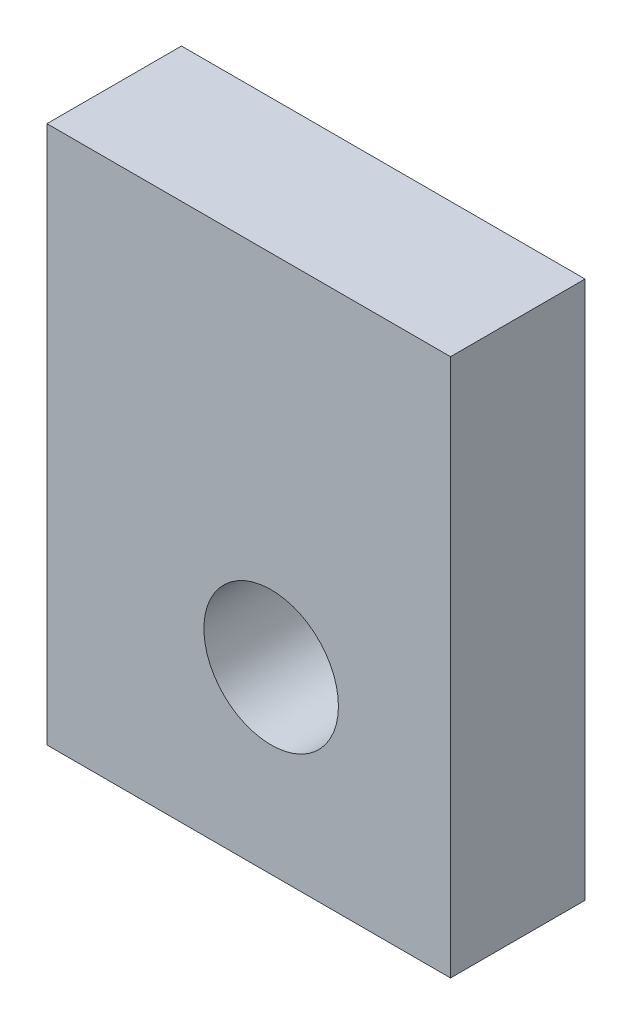
ISO-10303-21;
HEADER;
FILE_DESCRIPTION(('STEP AP214'),'2;1');
FILE_NAME('part.step','',(''),(''),'','','');
FILE_SCHEMA(('AUTOMOTIVE_DESIGN { 1 0 10303 214 1 1 1 1 }'));
ENDSEC;
DATA;
#1=APPLICATION_CONTEXT('core data for automotive mechanical design processes');
#2=APPLICATION_PROTOCOL_DEFINITION('international standard','automotive_design',2000,#1);
#3=PRODUCT_CONTEXT('',#1,'mechanical');
#4=PRODUCT('Part','Part','',(#3));
#5=PRODUCT_RELATED_PRODUCT_CATEGORY('part','',(#4));
#6=PRODUCT_DEFINITION_FORMATION('','',#4);
#7=PRODUCT_DEFINITION_CONTEXT('part definition',#1,'design');
#8=PRODUCT_DEFINITION('design','',#6,#7);
#9=PRODUCT_DEFINITION_SHAPE('','',#8);
#10=(LENGTH_UNIT() NAMED_UNIT(*) SI_UNIT(.MILLI.,.METRE.));
#11=(NAMED_UNIT(*) PLANE_ANGLE_UNIT() SI_UNIT($,.RADIAN.));
#12=(NAMED_UNIT(*) SI_UNIT($,.STERADIAN.) SOLID_ANGLE_UNIT());
#13=UNCERTAINTY_MEASURE_WITH_UNIT(LENGTH_MEASURE(1.E-05),#10,'distance_accuracy_value','');
#14=(GEOMETRIC_REPRESENTATION_CONTEXT(3) GLOBAL_UNCERTAINTY_ASSIGNED_CONTEXT((#13)) GLOBAL_UNIT_ASSIGNED_CONTEXT((#10,
#11,#12)) REPRESENTATION_CONTEXT('',''));
#15=CARTESIAN_POINT('',(0.,0.,0.));
#16=DIRECTION('',(0.,0.,1.));
#17=DIRECTION('',(1.,0.,0.));
#18=AXIS2_PLACEMENT_3D('',#15,#16,#17);
#19=CARTESIAN_POINT('',(0.,0.,3.));
#20=DIRECTION('',(1.,0.,0.));
#21=DIRECTION('',(0.,1.,0.));
#22=AXIS2_PLACEMENT_3D('',#19,#20,#21);
#23=PLANE('',#22);
#24=DIRECTION('',(0.,-1.,0.));
#25=VECTOR('',#24,1.);
#26=CARTESIAN_POINT('',(0.,0.,0.));
#27=LINE('',#26,#25);
#28=CARTESIAN_POINT('',(0.,12.,0.));
#29=VERTEX_POINT('',#28);
#30=CARTESIAN_POINT('',(0.,0.,0.));
#31=VERTEX_POINT('',#30);
#32=EDGE_CURVE('E98',#29,#31,#27,.T.);
#33=ORIENTED_EDGE('',*,*,#32,.T.);
#34=DIRECTION('',(0.,0.,-1.));
#35=VECTOR('',#34,1.);
#36=CARTESIAN_POINT('',(0.,0.,3.));
#37=LINE('',#36,#35);
#38=CARTESIAN_POINT('',(0.,0.,3.));
#39=VERTEX_POINT('',#38);
#40=EDGE_CURVE('E11',#39,#31,#37,.T.);
#41=ORIENTED_EDGE('',*,*,#40,.F.);
#42=DIRECTION('',(0.,-1.,0.));
#43=VECTOR('',#42,1.);
#44=CARTESIAN_POINT('',(0.,0.,3.));
#45=LINE('',#44,#43);
#46=CARTESIAN_POINT('',(0.,12.,3.));
#47=VERTEX_POINT('',#46);
#48=EDGE_CURVE('E86',#47,#39,#45,.T.);
#49=ORIENTED_EDGE('',*,*,#48,.F.);
#50=DIRECTION('',(0.,0.,-1.));
#51=VECTOR('',#50,1.);
#52=CARTESIAN_POINT('',(0.,12.,3.));
#53=LINE('',#52,#51);
#54=EDGE_CURVE('E94',#47,#29,#53,.T.);
#55=ORIENTED_EDGE('',*,*,#54,.T.);
#56=EDGE_LOOP('',(#33,#41,#49,#55));
#57=FACE_BOUND('',#56,.T.);
#58=ADVANCED_FACE('F35',(#57),#23,.F.);
#59=CARTESIAN_POINT('',(0.,0.,3.));
#60=DIRECTION('',(0.,1.,0.));
#61=DIRECTION('',(-1.,0.,0.));
#62=AXIS2_PLACEMENT_3D('',#59,#60,#61);
#63=PLANE('',#62);
#64=DIRECTION('',(1.,0.,0.));
#65=VECTOR('',#64,1.);
#66=CARTESIAN_POINT('',(0.,0.,0.));
#67=LINE('',#66,#65);
#68=CARTESIAN_POINT('',(8.99999999999999,0.,0.));
#69=VERTEX_POINT('',#68);
#70=EDGE_CURVE('E90',#31,#69,#67,.T.);
#71=ORIENTED_EDGE('',*,*,#70,.T.);
#72=DIRECTION('',(0.,0.,-1.));
#73=VECTOR('',#72,1.);
#74=CARTESIAN_POINT('',(8.99999999999999,0.,3.));
#75=LINE('',#74,#73);
#76=CARTESIAN_POINT('',(8.99999999999999,0.,3.));
#77=VERTEX_POINT('',#76);
#78=EDGE_CURVE('E43',#77,#69,#75,.T.);
#79=ORIENTED_EDGE('',*,*,#78,.F.);
#80=DIRECTION('',(1.,0.,0.));
#81=VECTOR('',#80,1.);
#82=CARTESIAN_POINT('',(0.,0.,3.));
#83=LINE('',#82,#81);
#84=EDGE_CURVE('E81',#39,#77,#83,.T.);
#85=ORIENTED_EDGE('',*,*,#84,.F.);
#86=ORIENTED_EDGE('',*,*,#40,.T.);
#87=EDGE_LOOP('',(#71,#79,#85,#86));
#88=FACE_BOUND('',#87,.T.);
#89=ADVANCED_FACE('F89',(#88),#63,.F.);
#90=CARTESIAN_POINT('',(8.99999999999999,0.,3.));
#91=DIRECTION('',(-1.,0.,0.));
#92=DIRECTION('',(0.,-1.,0.));
#93=AXIS2_PLACEMENT_3D('',#90,#91,#92);
#94=PLANE('',#93);
#95=DIRECTION('',(0.,1.,0.));
#96=VECTOR('',#95,1.);
#97=CARTESIAN_POINT('',(8.99999999999999,0.,0.));
#98=LINE('',#97,#96);
#99=CARTESIAN_POINT('',(9.,12.,0.));
#100=VERTEX_POINT('',#99);
#101=EDGE_CURVE('E68',#69,#100,#98,.T.);
#102=ORIENTED_EDGE('',*,*,#101,.T.);
#103=DIRECTION('',(0.,0.,-1.));
#104=VECTOR('',#103,1.);
#105=CARTESIAN_POINT('',(9.,12.,3.));
#106=LINE('',#105,#104);
#107=CARTESIAN_POINT('',(9.,12.,3.));
#108=VERTEX_POINT('',#107);
#109=EDGE_CURVE('E91',#108,#100,#106,.T.);
#110=ORIENTED_EDGE('',*,*,#109,.F.);
#111=DIRECTION('',(0.,1.,0.));
#112=VECTOR('',#111,1.);
#113=CARTESIAN_POINT('',(8.99999999999999,0.,3.));
#114=LINE('',#113,#112);
#115=EDGE_CURVE('E84',#77,#108,#114,.T.);
#116=ORIENTED_EDGE('',*,*,#115,.F.);
#117=ORIENTED_EDGE('',*,*,#78,.T.);
#118=EDGE_LOOP('',(#102,#110,#116,#117));
#119=FACE_BOUND('',#118,.T.);
#120=ADVANCED_FACE('F92',(#119),#94,.F.);
#121=CARTESIAN_POINT('',(0.,12.,3.));
#122=DIRECTION('',(0.,-1.,0.));
#123=DIRECTION('',(1.,0.,0.));
#124=AXIS2_PLACEMENT_3D('',#121,#122,#123);
#125=PLANE('',#124);
#126=DIRECTION('',(-1.,0.,0.));
#127=VECTOR('',#126,1.);
#128=CARTESIAN_POINT('',(0.,12.,0.));
#129=LINE('',#128,#127);
#130=EDGE_CURVE('E74',#100,#29,#129,.T.);
#131=ORIENTED_EDGE('',*,*,#130,.T.);
#132=ORIENTED_EDGE('',*,*,#54,.F.);
#133=DIRECTION('',(-1.,0.,0.));
#134=VECTOR('',#133,1.);
#135=CARTESIAN_POINT('',(0.,12.,3.));
#136=LINE('',#135,#134);
#137=EDGE_CURVE('E51',#108,#47,#136,.T.);
#138=ORIENTED_EDGE('',*,*,#137,.F.);
#139=ORIENTED_EDGE('',*,*,#109,.T.);
#140=EDGE_LOOP('',(#131,#132,#138,#139));
#141=FACE_BOUND('',#140,.T.);
#142=ADVANCED_FACE('F106',(#141),#125,.F.);
#143=CARTESIAN_POINT('',(0.,0.,3.));
#144=DIRECTION('',(0.,0.,-1.));
#145=DIRECTION('',(-1.,0.,0.));
#146=AXIS2_PLACEMENT_3D('',#143,#144,#145);
#147=PLANE('',#146);
#148=CARTESIAN_POINT('',(5.,4.,3.));
#149=DIRECTION('',(0.,0.,1.));
#150=DIRECTION('',(1.,0.,0.));
#151=AXIS2_PLACEMENT_3D('',#148,#149,#150);
#152=CIRCLE('',#151,1.5);
#153=CARTESIAN_POINT('',(6.5,4.,3.));
#154=VERTEX_POINT('',#153);
#155=EDGE_CURVE('E112',#154,#154,#152,.T.);
#156=ORIENTED_EDGE('',*,*,#155,.F.);
#157=EDGE_LOOP('',(#156));
#158=FACE_BOUND('',#157,.T.);
#159=ORIENTED_EDGE('',*,*,#48,.T.);
#160=ORIENTED_EDGE('',*,*,#84,.T.);
#161=ORIENTED_EDGE('',*,*,#115,.T.);
#162=ORIENTED_EDGE('',*,*,#137,.T.);
#163=EDGE_LOOP('',(#159,#160,#161,#162));
#164=FACE_BOUND('',#163,.T.);
#165=ADVANCED_FACE('F82',(#158,#164),#147,.F.);
#166=CARTESIAN_POINT('',(0.,0.,0.));
#167=DIRECTION('',(0.,0.,-1.));
#168=DIRECTION('',(-1.,0.,0.));
#169=AXIS2_PLACEMENT_3D('',#166,#167,#168);
#170=PLANE('',#169);
#171=CARTESIAN_POINT('',(5.,4.,0.));
#172=DIRECTION('',(0.,0.,1.));
#173=DIRECTION('',(1.,0.,0.));
#174=AXIS2_PLACEMENT_3D('',#171,#172,#173);
#175=CIRCLE('',#174,1.5);
#176=CARTESIAN_POINT('',(6.5,4.,0.));
#177=VERTEX_POINT('',#176);
#178=EDGE_CURVE('E101',#177,#177,#175,.T.);
#179=ORIENTED_EDGE('',*,*,#178,.T.);
#180=EDGE_LOOP('',(#179));
#181=FACE_BOUND('',#180,.T.);
#182=ORIENTED_EDGE('',*,*,#32,.F.);
#183=ORIENTED_EDGE('',*,*,#130,.F.);
#184=ORIENTED_EDGE('',*,*,#101,.F.);
#185=ORIENTED_EDGE('',*,*,#70,.F.);
#186=EDGE_LOOP('',(#182,#183,#184,#185));
#187=FACE_BOUND('',#186,.T.);
#188=ADVANCED_FACE('F109',(#181,#187),#170,.T.);
#189=CARTESIAN_POINT('',(5.,4.,0.));
#190=DIRECTION('',(0.,0.,1.));
#191=DIRECTION('',(1.,0.,0.));
#192=AXIS2_PLACEMENT_3D('',#189,#190,#191);
#193=CYLINDRICAL_SURFACE('',#192,1.5);
#194=ORIENTED_EDGE('',*,*,#178,.F.);
#195=EDGE_LOOP('',(#194));
#196=FACE_BOUND('',#195,.T.);
#197=ORIENTED_EDGE('',*,*,#155,.T.);
#198=EDGE_LOOP('',(#197));
#199=FACE_BOUND('',#198,.T.);
#200=ADVANCED_FACE('F119',(#196,#199),#193,.F.);
#201=CLOSED_SHELL('',(#58,#89,#120,#142,#165,#188,#200));
#202=MANIFOLD_SOLID_BREP('B2',#201);
#203=ADVANCED_BREP_SHAPE_REPRESENTATION('',(#18,#202),#14);
#204=SHAPE_DEFINITION_REPRESENTATION(#9,#203);
ENDSEC;
END-ISO-10303-21;
